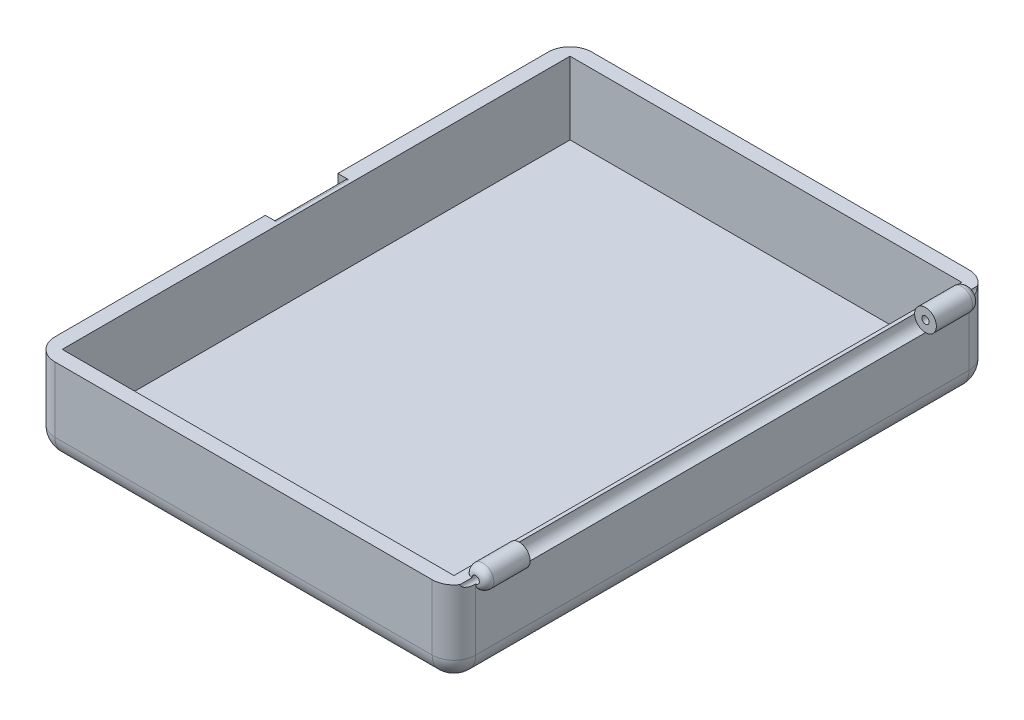
ISO-10303-21;
HEADER;
FILE_DESCRIPTION(('STEP AP214'),'2;1');
FILE_NAME('part.step','',(''),(''),'','','');
FILE_SCHEMA(('AUTOMOTIVE_DESIGN { 1 0 10303 214 1 1 1 1 }'));
ENDSEC;
DATA;
#1=APPLICATION_CONTEXT('core data for automotive mechanical design processes');
#2=APPLICATION_PROTOCOL_DEFINITION('international standard','automotive_design',2000,#1);
#3=PRODUCT_CONTEXT('',#1,'mechanical');
#4=PRODUCT('Part','Part','',(#3));
#5=PRODUCT_RELATED_PRODUCT_CATEGORY('part','',(#4));
#6=PRODUCT_DEFINITION_FORMATION('','',#4);
#7=PRODUCT_DEFINITION_CONTEXT('part definition',#1,'design');
#8=PRODUCT_DEFINITION('design','',#6,#7);
#9=PRODUCT_DEFINITION_SHAPE('','',#8);
#10=(LENGTH_UNIT() NAMED_UNIT(*) SI_UNIT(.MILLI.,.METRE.));
#11=(NAMED_UNIT(*) PLANE_ANGLE_UNIT() SI_UNIT($,.RADIAN.));
#12=(NAMED_UNIT(*) SI_UNIT($,.STERADIAN.) SOLID_ANGLE_UNIT());
#13=UNCERTAINTY_MEASURE_WITH_UNIT(LENGTH_MEASURE(1.E-05),#10,'distance_accuracy_value','');
#14=(GEOMETRIC_REPRESENTATION_CONTEXT(3) GLOBAL_UNCERTAINTY_ASSIGNED_CONTEXT((#13)) GLOBAL_UNIT_ASSIGNED_CONTEXT((#10,
#11,#12)) REPRESENTATION_CONTEXT('',''));
#15=CARTESIAN_POINT('',(0.,0.,0.));
#16=DIRECTION('',(0.,0.,1.));
#17=DIRECTION('',(1.,0.,0.));
#18=AXIS2_PLACEMENT_3D('',#15,#16,#17);
#19=CARTESIAN_POINT('',(-2.,5.,-40.));
#20=DIRECTION('',(0.,0.,-1.));
#21=DIRECTION('',(-1.,0.,0.));
#22=AXIS2_PLACEMENT_3D('',#19,#20,#21);
#23=PLANE('',#22);
#24=CARTESIAN_POINT('',(-0.499999999999997,11.5,-40.));
#25=DIRECTION('',(0.,0.,1.));
#26=DIRECTION('',(1.,0.,0.));
#27=AXIS2_PLACEMENT_3D('',#24,#25,#26);
#28=CIRCLE('',#27,0.5);
#29=CARTESIAN_POINT('',(-0.499999999999997,12.,-40.));
#30=VERTEX_POINT('',#29);
#31=CARTESIAN_POINT('',(-0.499999999999997,11.,-40.));
#32=VERTEX_POINT('',#31);
#33=EDGE_CURVE('E223',#30,#32,#28,.T.);
#34=ORIENTED_EDGE('',*,*,#33,.F.);
#35=DIRECTION('',(-1.,0.,0.));
#36=VECTOR('',#35,1.);
#37=CARTESIAN_POINT('',(-2.,12.,-40.));
#38=LINE('',#37,#36);
#39=CARTESIAN_POINT('',(-2.,12.,-40.));
#40=VERTEX_POINT('',#39);
#41=EDGE_CURVE('E212',#30,#40,#38,.T.);
#42=ORIENTED_EDGE('',*,*,#41,.T.);
#43=DIRECTION('',(0.,1.,0.));
#44=VECTOR('',#43,1.);
#45=CARTESIAN_POINT('',(-2.,5.,-40.));
#46=LINE('',#45,#44);
#47=CARTESIAN_POINT('',(-2.,5.,-40.));
#48=VERTEX_POINT('',#47);
#49=EDGE_CURVE('E246',#48,#40,#46,.T.);
#50=ORIENTED_EDGE('',*,*,#49,.F.);
#51=DIRECTION('',(-1.,0.,0.));
#52=VECTOR('',#51,1.);
#53=CARTESIAN_POINT('',(-2.,5.,-40.));
#54=LINE('',#53,#52);
#55=CARTESIAN_POINT('',(-0.499999999999997,5.,-40.));
#56=VERTEX_POINT('',#55);
#57=EDGE_CURVE('E241',#56,#48,#54,.T.);
#58=ORIENTED_EDGE('',*,*,#57,.F.);
#59=DIRECTION('',(0.,1.,0.));
#60=VECTOR('',#59,1.);
#61=CARTESIAN_POINT('',(-0.499999999999997,5.,-40.));
#62=LINE('',#61,#60);
#63=EDGE_CURVE('E251',#56,#32,#62,.T.);
#64=ORIENTED_EDGE('',*,*,#63,.T.);
#65=EDGE_LOOP('',(#34,#42,#50,#58,#64));
#66=FACE_BOUND('',#65,.T.);
#67=ADVANCED_FACE('F39',(#66),#23,.F.);
#68=CARTESIAN_POINT('',(-0.499999999999997,5.,-40.));
#69=DIRECTION('',(1.,0.,0.));
#70=DIRECTION('',(0.,0.,-1.));
#71=AXIS2_PLACEMENT_3D('',#68,#69,#70);
#72=PLANE('',#71);
#73=DIRECTION('',(0.,0.,-1.));
#74=VECTOR('',#73,1.);
#75=CARTESIAN_POINT('',(-0.499999999999995,11.,-30.));
#76=LINE('',#75,#74);
#77=CARTESIAN_POINT('',(-0.499999999999995,11.,-30.));
#78=VERTEX_POINT('',#77);
#79=EDGE_CURVE('E55',#32,#78,#76,.F.);
#80=ORIENTED_EDGE('',*,*,#79,.F.);
#81=ORIENTED_EDGE('',*,*,#63,.F.);
#82=DIRECTION('',(0.,0.,-1.));
#83=VECTOR('',#82,1.);
#84=CARTESIAN_POINT('',(-0.499999999999997,5.,-40.));
#85=LINE('',#84,#83);
#86=CARTESIAN_POINT('',(-0.499999999999995,5.,-30.));
#87=VERTEX_POINT('',#86);
#88=EDGE_CURVE('E237',#87,#56,#85,.T.);
#89=ORIENTED_EDGE('',*,*,#88,.F.);
#90=DIRECTION('',(0.,1.,0.));
#91=VECTOR('',#90,1.);
#92=CARTESIAN_POINT('',(-0.499999999999995,5.,-30.));
#93=LINE('',#92,#91);
#94=EDGE_CURVE('E254',#87,#78,#93,.T.);
#95=ORIENTED_EDGE('',*,*,#94,.T.);
#96=EDGE_LOOP('',(#80,#81,#89,#95));
#97=FACE_BOUND('',#96,.T.);
#98=ADVANCED_FACE('F324',(#97),#72,.F.);
#99=CARTESIAN_POINT('',(-2.,5.,-30.));
#100=DIRECTION('',(0.,0.,1.));
#101=DIRECTION('',(1.,0.,0.));
#102=AXIS2_PLACEMENT_3D('',#99,#100,#101);
#103=PLANE('',#102);
#104=CARTESIAN_POINT('',(-0.499999999999997,11.5,-30.));
#105=DIRECTION('',(0.,0.,1.));
#106=DIRECTION('',(1.,0.,0.));
#107=AXIS2_PLACEMENT_3D('',#104,#105,#106);
#108=CIRCLE('',#107,0.5);
#109=CARTESIAN_POINT('',(-0.499999999999995,12.,-30.));
#110=VERTEX_POINT('',#109);
#111=EDGE_CURVE('E11',#78,#110,#108,.F.);
#112=ORIENTED_EDGE('',*,*,#111,.F.);
#113=ORIENTED_EDGE('',*,*,#94,.F.);
#114=DIRECTION('',(1.,0.,0.));
#115=VECTOR('',#114,1.);
#116=CARTESIAN_POINT('',(-2.,5.,-30.));
#117=LINE('',#116,#115);
#118=CARTESIAN_POINT('',(-2.,5.,-30.));
#119=VERTEX_POINT('',#118);
#120=EDGE_CURVE('E233',#119,#87,#117,.T.);
#121=ORIENTED_EDGE('',*,*,#120,.F.);
#122=DIRECTION('',(0.,1.,0.));
#123=VECTOR('',#122,1.);
#124=CARTESIAN_POINT('',(-2.,5.,-30.));
#125=LINE('',#124,#123);
#126=CARTESIAN_POINT('',(-2.,12.,-30.));
#127=VERTEX_POINT('',#126);
#128=EDGE_CURVE('E219',#119,#127,#125,.T.);
#129=ORIENTED_EDGE('',*,*,#128,.T.);
#130=DIRECTION('',(1.,0.,0.));
#131=VECTOR('',#130,1.);
#132=CARTESIAN_POINT('',(-2.,12.,-30.));
#133=LINE('',#132,#131);
#134=EDGE_CURVE('E210',#127,#110,#133,.T.);
#135=ORIENTED_EDGE('',*,*,#134,.T.);
#136=EDGE_LOOP('',(#112,#113,#121,#129,#135));
#137=FACE_BOUND('',#136,.T.);
#138=ADVANCED_FACE('F217',(#137),#103,.F.);
#139=CARTESIAN_POINT('',(56.,12.,-0.999999999999959));
#140=DIRECTION('',(0.,0.,-1.));
#141=DIRECTION('',(-1.,0.,0.));
#142=AXIS2_PLACEMENT_3D('',#139,#140,#141);
#143=CYLINDRICAL_SURFACE('',#142,1.5);
#144=DIRECTION('',(0.,0.,-1.));
#145=VECTOR('',#144,1.);
#146=CARTESIAN_POINT('',(56.,10.5,-0.999999999999959));
#147=LINE('',#146,#145);
#148=CARTESIAN_POINT('',(56.,10.5,-6.99999999999996));
#149=VERTEX_POINT('',#148);
#150=CARTESIAN_POINT('',(56.,10.5,-1.99999999999996));
#151=VERTEX_POINT('',#150);
#152=EDGE_CURVE('E558',#149,#151,#147,.F.);
#153=ORIENTED_EDGE('',*,*,#152,.F.);
#154=CARTESIAN_POINT('',(56.,12.,-6.99999999999996));
#155=DIRECTION('',(0.,0.,-1.));
#156=DIRECTION('',(-1.,0.,0.));
#157=AXIS2_PLACEMENT_3D('',#154,#155,#156);
#158=CIRCLE('',#157,1.5);
#159=CARTESIAN_POINT('',(54.5,12.,-6.99999999999996));
#160=VERTEX_POINT('',#159);
#161=EDGE_CURVE('E259',#160,#149,#158,.T.);
#162=ORIENTED_EDGE('',*,*,#161,.F.);
#163=DIRECTION('',(0.,0.,-1.));
#164=VECTOR('',#163,1.);
#165=CARTESIAN_POINT('',(54.5,12.,-0.999999999999959));
#166=LINE('',#165,#164);
#167=CARTESIAN_POINT('',(54.5,12.,-1.99999999999996));
#168=VERTEX_POINT('',#167);
#169=EDGE_CURVE('E430',#168,#160,#166,.T.);
#170=ORIENTED_EDGE('',*,*,#169,.F.);
#171=CARTESIAN_POINT('',(56.,12.,-1.99999999999996));
#172=DIRECTION('',(0.,0.,-1.));
#173=DIRECTION('',(-1.,0.,0.));
#174=AXIS2_PLACEMENT_3D('',#171,#172,#173);
#175=CIRCLE('',#174,1.5);
#176=EDGE_CURVE('E374',#168,#151,#175,.T.);
#177=ORIENTED_EDGE('',*,*,#176,.T.);
#178=EDGE_LOOP('',(#153,#162,#170,#177));
#179=FACE_BOUND('',#178,.T.);
#180=ADVANCED_FACE('F337',(#179),#143,.T.);
#181=CARTESIAN_POINT('',(56.,12.,-72.));
#182=DIRECTION('',(0.,0.,1.));
#183=DIRECTION('',(1.,0.,0.));
#184=AXIS2_PLACEMENT_3D('',#181,#182,#183);
#185=CYLINDRICAL_SURFACE('',#184,0.499999999999999);
#186=CARTESIAN_POINT('',(55.5,12.,0.658312395177697));
#187=CARTESIAN_POINT('',(55.4999615359514,11.9808117965599,0.658359000901538));
#188=CARTESIAN_POINT('',(55.5011022028067,11.9616973550036,0.656651360080132));
#189=CARTESIAN_POINT('',(55.5053981586321,11.9244660067287,0.650152822799728));
#190=CARTESIAN_POINT('',(55.5085287089811,11.9063397775614,0.645399781620211));
#191=CARTESIAN_POINT('',(55.5164585738691,11.8715112352337,0.633243663591332));
#192=CARTESIAN_POINT('',(55.5212507254402,11.8548031872199,0.625851957739243));
#193=CARTESIAN_POINT('',(55.5321006879087,11.8229291394286,0.608902979096022));
#194=CARTESIAN_POINT('',(55.5381625027487,11.8077682491741,0.599338847200031));
#195=CARTESIAN_POINT('',(55.5543495838743,11.7720819233287,0.573412942822814));
#196=CARTESIAN_POINT('',(55.5650123613976,11.7525585594581,0.556014121615097));
#197=CARTESIAN_POINT('',(55.5873307308571,11.7168966525697,0.518617675701948));
#198=CARTESIAN_POINT('',(55.5989882255931,11.7007648109609,0.49861502991361));
#199=CARTESIAN_POINT('',(55.6308270280106,11.661277924017,0.44235327645327));
#200=CARTESIAN_POINT('',(55.651337737695,11.6406230066929,0.404403313902147));
#201=CARTESIAN_POINT('',(55.6916785877069,11.6054721967032,0.325464202490945));
#202=CARTESIAN_POINT('',(55.7115068636278,11.5909921086199,0.284467566484643));
#203=CARTESIAN_POINT('',(55.7496063336876,11.5666296831386,0.200737193937386));
#204=CARTESIAN_POINT('',(55.7678847946304,11.5567247940153,0.158013131653644));
#205=CARTESIAN_POINT('',(55.8026300683609,11.540201279739,0.0711939405220482));
#206=CARTESIAN_POINT('',(55.8190950642845,11.5335859273874,0.0270974924207964));
#207=CARTESIAN_POINT('',(55.8500610542317,11.5227285708738,-0.0622389891236715));
#208=CARTESIAN_POINT('',(55.864554568879,11.5184954237564,-0.107482645120754));
#209=CARTESIAN_POINT('',(55.891405695681,11.5117393431649,-0.19872827903056));
#210=CARTESIAN_POINT('',(55.9037627844491,11.5092168283242,-0.244730439748595));
#211=CARTESIAN_POINT('',(55.9291909661628,11.5048294742857,-0.349281699529611));
#212=CARTESIAN_POINT('',(55.9416212747959,11.5033030750241,-0.408000954890271));
#213=CARTESIAN_POINT('',(55.9629425437991,11.5012613747875,-0.526106877400987));
#214=CARTESIAN_POINT('',(55.9718324881697,11.5007463638901,-0.585493731115526));
#215=CARTESIAN_POINT('',(55.9859484398418,11.5001452898865,-0.703980436273835));
#216=CARTESIAN_POINT('',(55.991217107298,11.5000541568205,-0.763075188920547));
#217=CARTESIAN_POINT('',(55.9982432499278,11.5000013807879,-0.881446785583726));
#218=CARTESIAN_POINT('',(56.0000022866533,11.500039680212,-0.940723536859618));
#219=CARTESIAN_POINT('',(56.,11.5,-1.));
#220=B_SPLINE_CURVE_WITH_KNOTS('',3,(#186,#187,#188,#189,#190,#191,#192,#193,#194,#195,#196,
#197,#198,#199,#200,#201,#202,#203,#204,#205,#206,#207,#208,#209,#210,#211,#212,#213,#214,#215,
#216,#217,#218,#219),.UNSPECIFIED.,.F.,.F.,(4,2,2,2,2,2,2,2,2,2,2,2,2,2,2,2,4),(0.,
0.0573381720094235,0.113977086295263,0.17037481166274,0.226953142388571,0.311198558755972,
0.395608905298973,0.538283538979197,0.681321190365303,0.823646063340482,0.966112255212225,
1.10910469519338,1.25213211630405,1.43212269574156,1.61216489099272,1.79004798543928,
1.96785191608969),.UNSPECIFIED.);
#221=CARTESIAN_POINT('',(55.5,12.,0.658312395177697));
#222=VERTEX_POINT('',#221);
#223=CARTESIAN_POINT('',(56.,11.5,-0.999999999999959));
#224=VERTEX_POINT('',#223);
#225=EDGE_CURVE('E269',#222,#224,#220,.T.);
#226=ORIENTED_EDGE('',*,*,#225,.T.);
#227=CARTESIAN_POINT('',(56.,12.,-0.999999999999959));
#228=DIRECTION('',(0.,0.,-1.));
#229=DIRECTION('',(-1.,0.,0.));
#230=AXIS2_PLACEMENT_3D('',#227,#228,#229);
#231=CIRCLE('',#230,0.499999999999999);
#232=CARTESIAN_POINT('',(55.5,12.,-0.999999999999959));
#233=VERTEX_POINT('',#232);
#234=EDGE_CURVE('E378',#233,#224,#231,.T.);
#235=ORIENTED_EDGE('',*,*,#234,.F.);
#236=DIRECTION('',(0.,0.,1.));
#237=VECTOR('',#236,1.);
#238=CARTESIAN_POINT('',(55.5,12.,-72.));
#239=LINE('',#238,#237);
#240=EDGE_CURVE('E278',#222,#233,#239,.F.);
#241=ORIENTED_EDGE('',*,*,#240,.F.);
#242=EDGE_LOOP('',(#226,#235,#241));
#243=FACE_BOUND('',#242,.T.);
#244=CARTESIAN_POINT('',(56.,12.,-6.99999999999996));
#245=DIRECTION('',(0.,0.,-1.));
#246=DIRECTION('',(-1.,0.,0.));
#247=AXIS2_PLACEMENT_3D('',#244,#245,#246);
#248=CIRCLE('',#247,0.499999999999999);
#249=CARTESIAN_POINT('',(55.5,12.,-6.99999999999996));
#250=VERTEX_POINT('',#249);
#251=EDGE_CURVE('E279',#250,#250,#248,.F.);
#252=ORIENTED_EDGE('',*,*,#251,.F.);
#253=EDGE_LOOP('',(#252));
#254=FACE_BOUND('',#253,.T.);
#255=ADVANCED_FACE('F293',(#243,#254),#185,.F.);
#256=CARTESIAN_POINT('',(0.,12.,0.));
#257=DIRECTION('',(0.,-1.,0.));
#258=DIRECTION('',(0.,0.,-1.));
#259=AXIS2_PLACEMENT_3D('',#256,#257,#258);
#260=PLANE('',#259);
#261=DIRECTION('',(0.,0.,1.));
#262=VECTOR('',#261,1.);
#263=CARTESIAN_POINT('',(0.,12.,0.));
#264=LINE('',#263,#262);
#265=CARTESIAN_POINT('',(0.,12.,-70.));
#266=VERTEX_POINT('',#265);
#267=CARTESIAN_POINT('',(0.,12.,0.));
#268=VERTEX_POINT('',#267);
#269=EDGE_CURVE('E531',#266,#268,#264,.T.);
#270=ORIENTED_EDGE('',*,*,#269,.F.);
#271=DIRECTION('',(-1.,0.,0.));
#272=VECTOR('',#271,1.);
#273=CARTESIAN_POINT('',(0.,12.,-70.));
#274=LINE('',#273,#272);
#275=CARTESIAN_POINT('',(54.,12.,-70.));
#276=VERTEX_POINT('',#275);
#277=EDGE_CURVE('E521',#276,#266,#274,.T.);
#278=ORIENTED_EDGE('',*,*,#277,.F.);
#279=DIRECTION('',(0.,0.,-1.));
#280=VECTOR('',#279,1.);
#281=CARTESIAN_POINT('',(54.,12.,0.));
#282=LINE('',#281,#280);
#283=CARTESIAN_POINT('',(54.,12.,0.));
#284=VERTEX_POINT('',#283);
#285=EDGE_CURVE('E524',#284,#276,#282,.T.);
#286=ORIENTED_EDGE('',*,*,#285,.F.);
#287=DIRECTION('',(1.,0.,0.));
#288=VECTOR('',#287,1.);
#289=CARTESIAN_POINT('',(0.,12.,0.));
#290=LINE('',#289,#288);
#291=EDGE_CURVE('E528',#268,#284,#290,.T.);
#292=ORIENTED_EDGE('',*,*,#291,.F.);
#293=EDGE_LOOP('',(#270,#278,#286,#292));
#294=FACE_BOUND('',#293,.T.);
#295=DIRECTION('',(0.,0.,1.));
#296=VECTOR('',#295,1.);
#297=CARTESIAN_POINT('',(-2.,12.,2.));
#298=LINE('',#297,#296);
#299=CARTESIAN_POINT('',(-2.,12.,-69.));
#300=VERTEX_POINT('',#299);
#301=EDGE_CURVE('E502',#300,#40,#298,.T.);
#302=ORIENTED_EDGE('',*,*,#301,.T.);
#303=ORIENTED_EDGE('',*,*,#41,.F.);
#304=DIRECTION('',(0.,0.,-1.));
#305=VECTOR('',#304,1.);
#306=CARTESIAN_POINT('',(-0.499999999999997,12.,-40.));
#307=LINE('',#306,#305);
#308=EDGE_CURVE('E207',#110,#30,#307,.T.);
#309=ORIENTED_EDGE('',*,*,#308,.F.);
#310=ORIENTED_EDGE('',*,*,#134,.F.);
#311=CARTESIAN_POINT('',(-2.,12.,-1.));
#312=VERTEX_POINT('',#311);
#313=EDGE_CURVE('E505',#127,#312,#298,.T.);
#314=ORIENTED_EDGE('',*,*,#313,.T.);
#315=CARTESIAN_POINT('',(1.,12.,-1.));
#316=DIRECTION('',(0.,-1.,0.));
#317=DIRECTION('',(0.,0.,-1.));
#318=AXIS2_PLACEMENT_3D('',#315,#316,#317);
#319=CIRCLE('',#318,3.);
#320=CARTESIAN_POINT('',(0.999999999999999,12.,2.));
#321=VERTEX_POINT('',#320);
#322=EDGE_CURVE('E461',#312,#321,#319,.F.);
#323=ORIENTED_EDGE('',*,*,#322,.T.);
#324=DIRECTION('',(1.,0.,0.));
#325=VECTOR('',#324,1.);
#326=CARTESIAN_POINT('',(-2.,12.,2.));
#327=LINE('',#326,#325);
#328=CARTESIAN_POINT('',(53.,12.,2.));
#329=VERTEX_POINT('',#328);
#330=EDGE_CURVE('E498',#321,#329,#327,.T.);
#331=ORIENTED_EDGE('',*,*,#330,.T.);
#332=CARTESIAN_POINT('',(53.,12.,-1.));
#333=DIRECTION('',(0.,-1.,0.));
#334=DIRECTION('',(0.,0.,-1.));
#335=AXIS2_PLACEMENT_3D('',#332,#333,#334);
#336=CIRCLE('',#335,3.);
#337=EDGE_CURVE('E470',#329,#222,#336,.F.);
#338=ORIENTED_EDGE('',*,*,#337,.T.);
#339=ORIENTED_EDGE('',*,*,#240,.T.);
#340=CARTESIAN_POINT('',(55.5,12.,-1.99999999999996));
#341=DIRECTION('',(0.,-1.,0.));
#342=DIRECTION('',(0.,0.,-1.));
#343=AXIS2_PLACEMENT_3D('',#340,#341,#342);
#344=CIRCLE('',#343,1.);
#345=EDGE_CURVE('E48',#233,#168,#344,.T.);
#346=ORIENTED_EDGE('',*,*,#345,.T.);
#347=ORIENTED_EDGE('',*,*,#169,.T.);
#348=CARTESIAN_POINT('',(54.5,12.,-63.));
#349=VERTEX_POINT('',#348);
#350=EDGE_CURVE('E549',#160,#349,#166,.T.);
#351=ORIENTED_EDGE('',*,*,#350,.T.);
#352=CARTESIAN_POINT('',(54.5,12.,-68.));
#353=VERTEX_POINT('',#352);
#354=EDGE_CURVE('E550',#349,#353,#166,.T.);
#355=ORIENTED_EDGE('',*,*,#354,.T.);
#356=CARTESIAN_POINT('',(55.5,12.,-68.));
#357=DIRECTION('',(0.,-1.,0.));
#358=DIRECTION('',(0.,0.,-1.));
#359=AXIS2_PLACEMENT_3D('',#356,#357,#358);
#360=CIRCLE('',#359,1.);
#361=CARTESIAN_POINT('',(55.5,12.,-69.));
#362=VERTEX_POINT('',#361);
#363=EDGE_CURVE('E364',#353,#362,#360,.T.);
#364=ORIENTED_EDGE('',*,*,#363,.T.);
#365=CARTESIAN_POINT('',(55.5,12.,-70.6583123951777));
#366=VERTEX_POINT('',#365);
#367=EDGE_CURVE('E306',#362,#366,#239,.F.);
#368=ORIENTED_EDGE('',*,*,#367,.T.);
#369=CARTESIAN_POINT('',(53.,12.,-69.));
#370=DIRECTION('',(0.,-1.,0.));
#371=DIRECTION('',(0.,0.,-1.));
#372=AXIS2_PLACEMENT_3D('',#369,#370,#371);
#373=CIRCLE('',#372,3.);
#374=CARTESIAN_POINT('',(53.,12.,-72.));
#375=VERTEX_POINT('',#374);
#376=EDGE_CURVE('E467',#366,#375,#373,.F.);
#377=ORIENTED_EDGE('',*,*,#376,.T.);
#378=DIRECTION('',(-1.,0.,0.));
#379=VECTOR('',#378,1.);
#380=CARTESIAN_POINT('',(-2.,12.,-72.));
#381=LINE('',#380,#379);
#382=CARTESIAN_POINT('',(0.999999999999999,12.,-72.));
#383=VERTEX_POINT('',#382);
#384=EDGE_CURVE('E494',#375,#383,#381,.T.);
#385=ORIENTED_EDGE('',*,*,#384,.T.);
#386=CARTESIAN_POINT('',(1.,12.,-69.));
#387=DIRECTION('',(0.,-1.,0.));
#388=DIRECTION('',(0.,0.,-1.));
#389=AXIS2_PLACEMENT_3D('',#386,#387,#388);
#390=CIRCLE('',#389,3.);
#391=EDGE_CURVE('E464',#383,#300,#390,.F.);
#392=ORIENTED_EDGE('',*,*,#391,.T.);
#393=EDGE_LOOP('',(#302,#303,#309,#310,#314,#323,#331,#338,#339,#346,#347,#351,#355,#364,#368,
#377,#385,#392));
#394=FACE_BOUND('',#393,.T.);
#395=ADVANCED_FACE('F209',(#294,#394),#260,.F.);
#396=CARTESIAN_POINT('',(0.,0.,0.));
#397=DIRECTION('',(0.,-1.,0.));
#398=DIRECTION('',(0.,0.,-1.));
#399=AXIS2_PLACEMENT_3D('',#396,#397,#398);
#400=PLANE('',#399);
#401=DIRECTION('',(1.,0.,0.));
#402=VECTOR('',#401,1.);
#403=CARTESIAN_POINT('',(-2.,0.,-1.));
#404=LINE('',#403,#402);
#405=CARTESIAN_POINT('',(53.,0.,-1.));
#406=VERTEX_POINT('',#405);
#407=CARTESIAN_POINT('',(1.,0.,-1.));
#408=VERTEX_POINT('',#407);
#409=EDGE_CURVE('E455',#406,#408,#404,.F.);
#410=ORIENTED_EDGE('',*,*,#409,.T.);
#411=DIRECTION('',(0.,0.,1.));
#412=VECTOR('',#411,1.);
#413=CARTESIAN_POINT('',(1.,0.,-72.));
#414=LINE('',#413,#412);
#415=CARTESIAN_POINT('',(1.,0.,-69.));
#416=VERTEX_POINT('',#415);
#417=EDGE_CURVE('E448',#408,#416,#414,.F.);
#418=ORIENTED_EDGE('',*,*,#417,.T.);
#419=DIRECTION('',(-1.,0.,0.));
#420=VECTOR('',#419,1.);
#421=CARTESIAN_POINT('',(56.,0.,-69.));
#422=LINE('',#421,#420);
#423=CARTESIAN_POINT('',(53.,0.,-69.));
#424=VERTEX_POINT('',#423);
#425=EDGE_CURVE('E452',#416,#424,#422,.F.);
#426=ORIENTED_EDGE('',*,*,#425,.T.);
#427=DIRECTION('',(0.,0.,-1.));
#428=VECTOR('',#427,1.);
#429=CARTESIAN_POINT('',(53.,0.,2.));
#430=LINE('',#429,#428);
#431=EDGE_CURVE('E458',#424,#406,#430,.F.);
#432=ORIENTED_EDGE('',*,*,#431,.T.);
#433=EDGE_LOOP('',(#410,#418,#426,#432));
#434=FACE_BOUND('',#433,.T.);
#435=ADVANCED_FACE('F668',(#434),#400,.T.);
#436=CARTESIAN_POINT('',(-2.,12.,2.));
#437=DIRECTION('',(1.,0.,0.));
#438=DIRECTION('',(0.,0.,-1.));
#439=AXIS2_PLACEMENT_3D('',#436,#437,#438);
#440=PLANE('',#439);
#441=DIRECTION('',(0.,0.,1.));
#442=VECTOR('',#441,1.);
#443=CARTESIAN_POINT('',(-2.,5.,-40.));
#444=LINE('',#443,#442);
#445=EDGE_CURVE('E229',#48,#119,#444,.T.);
#446=ORIENTED_EDGE('',*,*,#445,.F.);
#447=ORIENTED_EDGE('',*,*,#49,.T.);
#448=ORIENTED_EDGE('',*,*,#301,.F.);
#449=DIRECTION('',(0.,-1.,0.));
#450=VECTOR('',#449,1.);
#451=CARTESIAN_POINT('',(-2.,12.,-69.));
#452=LINE('',#451,#450);
#453=CARTESIAN_POINT('',(-2.,3.,-69.));
#454=VERTEX_POINT('',#453);
#455=EDGE_CURVE('E481',#300,#454,#452,.T.);
#456=ORIENTED_EDGE('',*,*,#455,.T.);
#457=DIRECTION('',(0.,0.,1.));
#458=VECTOR('',#457,1.);
#459=CARTESIAN_POINT('',(-2.,3.,2.));
#460=LINE('',#459,#458);
#461=CARTESIAN_POINT('',(-2.,3.,-1.));
#462=VERTEX_POINT('',#461);
#463=EDGE_CURVE('E478',#454,#462,#460,.T.);
#464=ORIENTED_EDGE('',*,*,#463,.T.);
#465=DIRECTION('',(0.,-1.,0.));
#466=VECTOR('',#465,1.);
#467=CARTESIAN_POINT('',(-2.,12.,-1.));
#468=LINE('',#467,#466);
#469=EDGE_CURVE('E474',#462,#312,#468,.F.);
#470=ORIENTED_EDGE('',*,*,#469,.T.);
#471=ORIENTED_EDGE('',*,*,#313,.F.);
#472=ORIENTED_EDGE('',*,*,#128,.F.);
#473=EDGE_LOOP('',(#446,#447,#448,#456,#464,#470,#471,#472));
#474=FACE_BOUND('',#473,.T.);
#475=ADVANCED_FACE('F607',(#474),#440,.F.);
#476=CARTESIAN_POINT('',(-2.,12.,2.));
#477=DIRECTION('',(0.,0.,-1.));
#478=DIRECTION('',(-1.,0.,0.));
#479=AXIS2_PLACEMENT_3D('',#476,#477,#478);
#480=PLANE('',#479);
#481=ORIENTED_EDGE('',*,*,#330,.F.);
#482=DIRECTION('',(0.,-1.,0.));
#483=VECTOR('',#482,1.);
#484=CARTESIAN_POINT('',(1.,12.,2.));
#485=LINE('',#484,#483);
#486=CARTESIAN_POINT('',(1.,3.,2.));
#487=VERTEX_POINT('',#486);
#488=EDGE_CURVE('E484',#321,#487,#485,.T.);
#489=ORIENTED_EDGE('',*,*,#488,.T.);
#490=DIRECTION('',(1.,0.,0.));
#491=VECTOR('',#490,1.);
#492=CARTESIAN_POINT('',(56.,3.,2.));
#493=LINE('',#492,#491);
#494=CARTESIAN_POINT('',(53.,3.,2.));
#495=VERTEX_POINT('',#494);
#496=EDGE_CURVE('E488',#487,#495,#493,.T.);
#497=ORIENTED_EDGE('',*,*,#496,.T.);
#498=DIRECTION('',(0.,-1.,0.));
#499=VECTOR('',#498,1.);
#500=CARTESIAN_POINT('',(53.,12.,2.));
#501=LINE('',#500,#499);
#502=EDGE_CURVE('E491',#495,#329,#501,.F.);
#503=ORIENTED_EDGE('',*,*,#502,.T.);
#504=EDGE_LOOP('',(#481,#489,#497,#503));
#505=FACE_BOUND('',#504,.T.);
#506=ADVANCED_FACE('F619',(#505),#480,.F.);
#507=CARTESIAN_POINT('',(56.,12.,2.));
#508=DIRECTION('',(-1.,0.,0.));
#509=DIRECTION('',(0.,0.,1.));
#510=AXIS2_PLACEMENT_3D('',#507,#508,#509);
#511=PLANE('',#510);
#512=DIRECTION('',(0.,-1.,0.));
#513=VECTOR('',#512,1.);
#514=CARTESIAN_POINT('',(56.,12.,-69.));
#515=LINE('',#514,#513);
#516=CARTESIAN_POINT('',(56.,3.,-69.));
#517=VERTEX_POINT('',#516);
#518=CARTESIAN_POINT('',(56.,11.5,-69.));
#519=VERTEX_POINT('',#518);
#520=EDGE_CURVE('E382',#517,#519,#515,.F.);
#521=ORIENTED_EDGE('',*,*,#520,.T.);
#522=CARTESIAN_POINT('',(56.,11.5,-68.));
#523=DIRECTION('',(-1.,0.,0.));
#524=DIRECTION('',(0.,0.,1.));
#525=AXIS2_PLACEMENT_3D('',#522,#523,#524);
#526=CIRCLE('',#525,1.);
#527=CARTESIAN_POINT('',(56.,10.5,-68.));
#528=VERTEX_POINT('',#527);
#529=EDGE_CURVE('E367',#519,#528,#526,.T.);
#530=ORIENTED_EDGE('',*,*,#529,.T.);
#531=CARTESIAN_POINT('',(56.,10.5,-63.));
#532=VERTEX_POINT('',#531);
#533=EDGE_CURVE('E308',#528,#532,#147,.F.);
#534=ORIENTED_EDGE('',*,*,#533,.T.);
#535=EDGE_CURVE('E557',#532,#149,#147,.F.);
#536=ORIENTED_EDGE('',*,*,#535,.T.);
#537=ORIENTED_EDGE('',*,*,#152,.T.);
#538=CARTESIAN_POINT('',(56.,11.5,-1.99999999999996));
#539=DIRECTION('',(-1.,0.,0.));
#540=DIRECTION('',(0.,0.,1.));
#541=AXIS2_PLACEMENT_3D('',#538,#539,#540);
#542=CIRCLE('',#541,1.);
#543=EDGE_CURVE('E360',#151,#224,#542,.T.);
#544=ORIENTED_EDGE('',*,*,#543,.T.);
#545=DIRECTION('',(0.,-1.,0.));
#546=VECTOR('',#545,1.);
#547=CARTESIAN_POINT('',(56.,12.,-1.));
#548=LINE('',#547,#546);
#549=CARTESIAN_POINT('',(56.,3.,-1.));
#550=VERTEX_POINT('',#549);
#551=EDGE_CURVE('E436',#224,#550,#548,.T.);
#552=ORIENTED_EDGE('',*,*,#551,.T.);
#553=DIRECTION('',(0.,0.,-1.));
#554=VECTOR('',#553,1.);
#555=CARTESIAN_POINT('',(56.,3.,-72.));
#556=LINE('',#555,#554);
#557=EDGE_CURVE('E433',#550,#517,#556,.T.);
#558=ORIENTED_EDGE('',*,*,#557,.T.);
#559=EDGE_LOOP('',(#521,#530,#534,#536,#537,#544,#552,#558));
#560=FACE_BOUND('',#559,.T.);
#561=ADVANCED_FACE('F642',(#560),#511,.F.);
#562=CARTESIAN_POINT('',(-2.,12.,-72.));
#563=DIRECTION('',(0.,0.,1.));
#564=DIRECTION('',(1.,0.,0.));
#565=AXIS2_PLACEMENT_3D('',#562,#563,#564);
#566=PLANE('',#565);
#567=DIRECTION('',(-1.,0.,0.));
#568=VECTOR('',#567,1.);
#569=CARTESIAN_POINT('',(-2.,3.,-72.));
#570=LINE('',#569,#568);
#571=CARTESIAN_POINT('',(53.,3.,-72.));
#572=VERTEX_POINT('',#571);
#573=CARTESIAN_POINT('',(1.,3.,-72.));
#574=VERTEX_POINT('',#573);
#575=EDGE_CURVE('E442',#572,#574,#570,.T.);
#576=ORIENTED_EDGE('',*,*,#575,.T.);
#577=DIRECTION('',(0.,-1.,0.));
#578=VECTOR('',#577,1.);
#579=CARTESIAN_POINT('',(1.,12.,-72.));
#580=LINE('',#579,#578);
#581=EDGE_CURVE('E439',#574,#383,#580,.F.);
#582=ORIENTED_EDGE('',*,*,#581,.T.);
#583=ORIENTED_EDGE('',*,*,#384,.F.);
#584=DIRECTION('',(0.,-1.,0.));
#585=VECTOR('',#584,1.);
#586=CARTESIAN_POINT('',(53.,12.,-72.));
#587=LINE('',#586,#585);
#588=EDGE_CURVE('E445',#375,#572,#587,.T.);
#589=ORIENTED_EDGE('',*,*,#588,.T.);
#590=EDGE_LOOP('',(#576,#582,#583,#589));
#591=FACE_BOUND('',#590,.T.);
#592=ADVANCED_FACE('F585',(#591),#566,.F.);
#593=CARTESIAN_POINT('',(0.,12.,0.));
#594=DIRECTION('',(1.,0.,0.));
#595=DIRECTION('',(0.,0.,-1.));
#596=AXIS2_PLACEMENT_3D('',#593,#594,#595);
#597=PLANE('',#596);
#598=DIRECTION('',(0.,0.,-1.));
#599=VECTOR('',#598,1.);
#600=CARTESIAN_POINT('',(0.,2.,0.));
#601=LINE('',#600,#599);
#602=CARTESIAN_POINT('',(0.,2.,0.));
#603=VERTEX_POINT('',#602);
#604=CARTESIAN_POINT('',(0.,2.,-70.));
#605=VERTEX_POINT('',#604);
#606=EDGE_CURVE('E534',#603,#605,#601,.T.);
#607=ORIENTED_EDGE('',*,*,#606,.T.);
#608=DIRECTION('',(0.,-1.,0.));
#609=VECTOR('',#608,1.);
#610=CARTESIAN_POINT('',(0.,12.,-70.));
#611=LINE('',#610,#609);
#612=EDGE_CURVE('E518',#266,#605,#611,.T.);
#613=ORIENTED_EDGE('',*,*,#612,.F.);
#614=ORIENTED_EDGE('',*,*,#269,.T.);
#615=DIRECTION('',(0.,-1.,0.));
#616=VECTOR('',#615,1.);
#617=CARTESIAN_POINT('',(0.,12.,0.));
#618=LINE('',#617,#616);
#619=EDGE_CURVE('E506',#268,#603,#618,.T.);
#620=ORIENTED_EDGE('',*,*,#619,.T.);
#621=EDGE_LOOP('',(#607,#613,#614,#620));
#622=FACE_BOUND('',#621,.T.);
#623=ADVANCED_FACE('F678',(#622),#597,.T.);
#624=CARTESIAN_POINT('',(0.,12.,0.));
#625=DIRECTION('',(0.,0.,-1.));
#626=DIRECTION('',(-1.,0.,0.));
#627=AXIS2_PLACEMENT_3D('',#624,#625,#626);
#628=PLANE('',#627);
#629=DIRECTION('',(1.,0.,0.));
#630=VECTOR('',#629,1.);
#631=CARTESIAN_POINT('',(0.,2.,0.));
#632=LINE('',#631,#630);
#633=CARTESIAN_POINT('',(54.,2.,0.));
#634=VERTEX_POINT('',#633);
#635=EDGE_CURVE('E387',#603,#634,#632,.T.);
#636=ORIENTED_EDGE('',*,*,#635,.F.);
#637=ORIENTED_EDGE('',*,*,#619,.F.);
#638=ORIENTED_EDGE('',*,*,#291,.T.);
#639=DIRECTION('',(0.,-1.,0.));
#640=VECTOR('',#639,1.);
#641=CARTESIAN_POINT('',(54.,12.,0.));
#642=LINE('',#641,#640);
#643=EDGE_CURVE('E510',#284,#634,#642,.T.);
#644=ORIENTED_EDGE('',*,*,#643,.T.);
#645=EDGE_LOOP('',(#636,#637,#638,#644));
#646=FACE_BOUND('',#645,.T.);
#647=ADVANCED_FACE('F741',(#646),#628,.T.);
#648=CARTESIAN_POINT('',(54.,12.,0.));
#649=DIRECTION('',(-1.,0.,0.));
#650=DIRECTION('',(0.,0.,1.));
#651=AXIS2_PLACEMENT_3D('',#648,#649,#650);
#652=PLANE('',#651);
#653=DIRECTION('',(0.,0.,-1.));
#654=VECTOR('',#653,1.);
#655=CARTESIAN_POINT('',(54.,2.,0.));
#656=LINE('',#655,#654);
#657=CARTESIAN_POINT('',(54.,2.,-70.));
#658=VERTEX_POINT('',#657);
#659=EDGE_CURVE('E541',#634,#658,#656,.T.);
#660=ORIENTED_EDGE('',*,*,#659,.F.);
#661=ORIENTED_EDGE('',*,*,#643,.F.);
#662=ORIENTED_EDGE('',*,*,#285,.T.);
#663=DIRECTION('',(0.,-1.,0.));
#664=VECTOR('',#663,1.);
#665=CARTESIAN_POINT('',(54.,12.,-70.));
#666=LINE('',#665,#664);
#667=EDGE_CURVE('E514',#276,#658,#666,.T.);
#668=ORIENTED_EDGE('',*,*,#667,.T.);
#669=EDGE_LOOP('',(#660,#661,#662,#668));
#670=FACE_BOUND('',#669,.T.);
#671=ADVANCED_FACE('F733',(#670),#652,.T.);
#672=CARTESIAN_POINT('',(0.,12.,-70.));
#673=DIRECTION('',(0.,0.,1.));
#674=DIRECTION('',(1.,0.,0.));
#675=AXIS2_PLACEMENT_3D('',#672,#673,#674);
#676=PLANE('',#675);
#677=DIRECTION('',(1.,0.,0.));
#678=VECTOR('',#677,1.);
#679=CARTESIAN_POINT('',(0.,2.,-70.));
#680=LINE('',#679,#678);
#681=EDGE_CURVE('E538',#605,#658,#680,.T.);
#682=ORIENTED_EDGE('',*,*,#681,.T.);
#683=ORIENTED_EDGE('',*,*,#667,.F.);
#684=ORIENTED_EDGE('',*,*,#277,.T.);
#685=ORIENTED_EDGE('',*,*,#612,.T.);
#686=EDGE_LOOP('',(#682,#683,#684,#685));
#687=FACE_BOUND('',#686,.T.);
#688=ADVANCED_FACE('F725',(#687),#676,.T.);
#689=CARTESIAN_POINT('',(0.,2.,0.));
#690=DIRECTION('',(0.,1.,0.));
#691=DIRECTION('',(0.,0.,1.));
#692=AXIS2_PLACEMENT_3D('',#689,#690,#691);
#693=PLANE('',#692);
#694=ORIENTED_EDGE('',*,*,#635,.T.);
#695=ORIENTED_EDGE('',*,*,#659,.T.);
#696=ORIENTED_EDGE('',*,*,#681,.F.);
#697=ORIENTED_EDGE('',*,*,#606,.F.);
#698=EDGE_LOOP('',(#694,#695,#696,#697));
#699=FACE_BOUND('',#698,.T.);
#700=ADVANCED_FACE('F314',(#699),#693,.T.);
#701=CARTESIAN_POINT('',(53.,12.,-69.));
#702=DIRECTION('',(0.,-1.,0.));
#703=DIRECTION('',(0.,0.,-1.));
#704=AXIS2_PLACEMENT_3D('',#701,#702,#703);
#705=CYLINDRICAL_SURFACE('',#704,3.);
#706=CARTESIAN_POINT('',(56.,11.5,-69.));
#707=CARTESIAN_POINT('',(56.0000005199056,11.5000098407388,-69.0420227982781));
#708=CARTESIAN_POINT('',(55.9991170511445,11.5000002513942,-69.084045270978));
#709=CARTESIAN_POINT('',(55.9955859427349,11.5000137776642,-69.1680182430285));
#710=CARTESIAN_POINT('',(55.9929382099897,11.5000368950047,-69.2099687384638));
#711=CARTESIAN_POINT('',(55.9858705738062,11.5001876657131,-69.2938621331985));
#712=CARTESIAN_POINT('',(55.9814447690287,11.5003156686771,-69.3358045372019));
#713=CARTESIAN_POINT('',(55.9708299845728,11.5008238301052,-69.4194604875588));
#714=CARTESIAN_POINT('',(55.9646410652255,11.5012039799418,-69.4611740416934));
#715=CARTESIAN_POINT('',(55.9435051632995,11.5029961533761,-69.5855132447728));
#716=CARTESIAN_POINT('',(55.9259581569273,11.5050575208107,-69.6677024479489));
#717=CARTESIAN_POINT('',(55.8840998265483,11.5131471783935,-69.8300379608899));
#718=CARTESIAN_POINT('',(55.8598027654416,11.5191671402792,-69.9101881934222));
#719=CARTESIAN_POINT('',(55.8251809365482,11.531497527422,-70.0093722242297));
#720=CARTESIAN_POINT('',(55.8177692684473,11.5343184586712,-70.0298790621602));
#721=CARTESIAN_POINT('',(55.8025327590561,11.5405710345507,-70.0706459007299));
#722=CARTESIAN_POINT('',(55.7947079269846,11.5440026655584,-70.0909059068644));
#723=CARTESIAN_POINT('',(55.7705865525409,11.5553800994296,-70.1514088226575));
#724=CARTESIAN_POINT('',(55.75369782653,11.5643904937986,-70.191218262531));
#725=CARTESIAN_POINT('',(55.7134976340735,11.5893477172083,-70.2806061192559));
#726=CARTESIAN_POINT('',(55.6897426486824,11.6065476935865,-70.329674569689));
#727=CARTESIAN_POINT('',(55.6535891085635,11.6390899770083,-70.3996999776278));
#728=CARTESIAN_POINT('',(55.6414832615044,11.6510213896918,-70.4223911221627));
#729=CARTESIAN_POINT('',(55.6174184948653,11.6775820141448,-70.4661989034643));
#730=CARTESIAN_POINT('',(55.6054593493204,11.6922063121518,-70.4873183112091));
#731=CARTESIAN_POINT('',(55.5850763372424,11.7206032479163,-70.522394510463));
#732=CARTESIAN_POINT('',(55.5765127219567,11.733683736954,-70.5368266757642));
#733=CARTESIAN_POINT('',(55.5600551008762,11.7618513218187,-70.5640878670894));
#734=CARTESIAN_POINT('',(55.5521617214469,11.7769402615514,-70.5769153986944));
#735=CARTESIAN_POINT('',(55.5374012384112,11.8094120260704,-70.6005598430862));
#736=CARTESIAN_POINT('',(55.5305471292102,11.8268194736971,-70.6113516541899));
#737=CARTESIAN_POINT('',(55.5185673950133,11.8636375929666,-70.6300126448793));
#738=CARTESIAN_POINT('',(55.5134350579393,11.8830400911335,-70.6378931860872));
#739=CARTESIAN_POINT('',(55.5064147574378,11.9186417865444,-70.6486109467333));
#740=CARTESIAN_POINT('',(55.5040473529792,11.9345190659309,-70.6521988627578));
#741=CARTESIAN_POINT('',(55.5008221679826,11.9669139259736,-70.6570731078552));
#742=CARTESIAN_POINT('',(55.4999781105873,11.9834359706464,-70.6583385162185));
#743=CARTESIAN_POINT('',(55.5,12.,-70.6583123951777));
#744=B_SPLINE_CURVE_WITH_KNOTS('',3,(#706,#707,#708,#709,#710,#711,#712,#713,#714,#715,#716,
#717,#718,#719,#720,#721,#722,#723,#724,#725,#726,#727,#728,#729,#730,#731,#732,#733,#734,#735,
#736,#737,#738,#739,#740,#741,#742,#743),.UNSPECIFIED.,.F.,.F.,(4,2,2,2,2,2,2,2,2,2,2,2,2,2,2,2,
2,2,4),(0.,0.12605847414002,0.252123600646824,0.378610634425717,0.505093340532964,
0.75696352790336,1.00830550795671,1.07425585321203,1.14020472753236,1.27260088735021,
1.44334213988643,1.52827184111027,1.61304807807225,1.6767481346378,1.74050708118652,
1.80500707964487,1.86925263028935,1.91836588799789,1.96791941735894),.UNSPECIFIED.);
#745=EDGE_CURVE('E299',#519,#366,#744,.T.);
#746=ORIENTED_EDGE('',*,*,#745,.F.);
#747=ORIENTED_EDGE('',*,*,#520,.F.);
#748=CARTESIAN_POINT('',(53.,3.,-69.));
#749=DIRECTION('',(0.,-1.,0.));
#750=DIRECTION('',(0.,0.,-1.));
#751=AXIS2_PLACEMENT_3D('',#748,#749,#750);
#752=CIRCLE('',#751,3.);
#753=EDGE_CURVE('E383',#572,#517,#752,.T.);
#754=ORIENTED_EDGE('',*,*,#753,.F.);
#755=ORIENTED_EDGE('',*,*,#588,.F.);
#756=ORIENTED_EDGE('',*,*,#376,.F.);
#757=EDGE_LOOP('',(#746,#747,#754,#755,#756));
#758=FACE_BOUND('',#757,.T.);
#759=ADVANCED_FACE('F310',(#758),#705,.T.);
#760=CARTESIAN_POINT('',(53.,3.,-69.));
#761=DIRECTION('',(0.,0.,1.));
#762=DIRECTION('',(1.,0.,0.));
#763=AXIS2_PLACEMENT_3D('',#760,#761,#762);
#764=SPHERICAL_SURFACE('',#763,3.);
#765=CARTESIAN_POINT('',(53.,3.,-69.));
#766=DIRECTION('',(1.,0.,0.));
#767=DIRECTION('',(0.,0.,-1.));
#768=AXIS2_PLACEMENT_3D('',#765,#766,#767);
#769=CIRCLE('',#768,3.);
#770=EDGE_CURVE('E392',#572,#424,#769,.F.);
#771=ORIENTED_EDGE('',*,*,#770,.F.);
#772=ORIENTED_EDGE('',*,*,#753,.T.);
#773=CARTESIAN_POINT('',(53.,3.,-69.));
#774=DIRECTION('',(0.,0.,-1.));
#775=DIRECTION('',(-1.,0.,0.));
#776=AXIS2_PLACEMENT_3D('',#773,#774,#775);
#777=CIRCLE('',#776,3.);
#778=EDGE_CURVE('E388',#424,#517,#777,.F.);
#779=ORIENTED_EDGE('',*,*,#778,.F.);
#780=EDGE_LOOP('',(#771,#772,#779));
#781=FACE_BOUND('',#780,.T.);
#782=ADVANCED_FACE('F313',(#781),#764,.T.);
#783=CARTESIAN_POINT('',(53.,12.,-1.));
#784=DIRECTION('',(0.,-1.,0.));
#785=DIRECTION('',(0.,0.,-1.));
#786=AXIS2_PLACEMENT_3D('',#783,#784,#785);
#787=CYLINDRICAL_SURFACE('',#786,3.);
#788=ORIENTED_EDGE('',*,*,#225,.F.);
#789=ORIENTED_EDGE('',*,*,#337,.F.);
#790=ORIENTED_EDGE('',*,*,#502,.F.);
#791=CARTESIAN_POINT('',(53.,3.,-1.));
#792=DIRECTION('',(0.,-1.,0.));
#793=DIRECTION('',(0.,0.,-1.));
#794=AXIS2_PLACEMENT_3D('',#791,#792,#793);
#795=CIRCLE('',#794,3.);
#796=EDGE_CURVE('E396',#550,#495,#795,.T.);
#797=ORIENTED_EDGE('',*,*,#796,.F.);
#798=ORIENTED_EDGE('',*,*,#551,.F.);
#799=EDGE_LOOP('',(#788,#789,#790,#797,#798));
#800=FACE_BOUND('',#799,.T.);
#801=ADVANCED_FACE('F281',(#800),#787,.T.);
#802=CARTESIAN_POINT('',(53.,3.,2.));
#803=DIRECTION('',(0.,0.,1.));
#804=DIRECTION('',(1.,0.,0.));
#805=AXIS2_PLACEMENT_3D('',#802,#803,#804);
#806=CYLINDRICAL_SURFACE('',#805,3.);
#807=ORIENTED_EDGE('',*,*,#778,.T.);
#808=ORIENTED_EDGE('',*,*,#557,.F.);
#809=CARTESIAN_POINT('',(53.,3.,-1.));
#810=DIRECTION('',(0.,0.,1.));
#811=DIRECTION('',(1.,0.,0.));
#812=AXIS2_PLACEMENT_3D('',#809,#810,#811);
#813=CIRCLE('',#812,3.);
#814=EDGE_CURVE('E400',#406,#550,#813,.T.);
#815=ORIENTED_EDGE('',*,*,#814,.F.);
#816=ORIENTED_EDGE('',*,*,#431,.F.);
#817=EDGE_LOOP('',(#807,#808,#815,#816));
#818=FACE_BOUND('',#817,.T.);
#819=ADVANCED_FACE('F640',(#818),#806,.T.);
#820=CARTESIAN_POINT('',(-2.,3.,-69.));
#821=DIRECTION('',(1.,0.,0.));
#822=DIRECTION('',(0.,0.,-1.));
#823=AXIS2_PLACEMENT_3D('',#820,#821,#822);
#824=CYLINDRICAL_SURFACE('',#823,3.);
#825=ORIENTED_EDGE('',*,*,#770,.T.);
#826=ORIENTED_EDGE('',*,*,#425,.F.);
#827=CARTESIAN_POINT('',(1.,3.,-69.));
#828=DIRECTION('',(-1.,0.,0.));
#829=DIRECTION('',(0.,0.,1.));
#830=AXIS2_PLACEMENT_3D('',#827,#828,#829);
#831=CIRCLE('',#830,3.);
#832=EDGE_CURVE('E404',#574,#416,#831,.T.);
#833=ORIENTED_EDGE('',*,*,#832,.F.);
#834=ORIENTED_EDGE('',*,*,#575,.F.);
#835=EDGE_LOOP('',(#825,#826,#833,#834));
#836=FACE_BOUND('',#835,.T.);
#837=ADVANCED_FACE('F596',(#836),#824,.T.);
#838=CARTESIAN_POINT('',(1.,12.,-69.));
#839=DIRECTION('',(0.,-1.,0.));
#840=DIRECTION('',(0.,0.,-1.));
#841=AXIS2_PLACEMENT_3D('',#838,#839,#840);
#842=CYLINDRICAL_SURFACE('',#841,3.);
#843=ORIENTED_EDGE('',*,*,#391,.F.);
#844=ORIENTED_EDGE('',*,*,#581,.F.);
#845=CARTESIAN_POINT('',(1.,3.,-69.));
#846=DIRECTION('',(0.,-1.,0.));
#847=DIRECTION('',(0.,0.,-1.));
#848=AXIS2_PLACEMENT_3D('',#845,#846,#847);
#849=CIRCLE('',#848,3.);
#850=EDGE_CURVE('E408',#454,#574,#849,.T.);
#851=ORIENTED_EDGE('',*,*,#850,.F.);
#852=ORIENTED_EDGE('',*,*,#455,.F.);
#853=EDGE_LOOP('',(#843,#844,#851,#852));
#854=FACE_BOUND('',#853,.T.);
#855=ADVANCED_FACE('F591',(#854),#842,.T.);
#856=CARTESIAN_POINT('',(53.,3.,-1.));
#857=DIRECTION('',(0.,0.,1.));
#858=DIRECTION('',(1.,0.,0.));
#859=AXIS2_PLACEMENT_3D('',#856,#857,#858);
#860=SPHERICAL_SURFACE('',#859,3.);
#861=ORIENTED_EDGE('',*,*,#814,.T.);
#862=ORIENTED_EDGE('',*,*,#796,.T.);
#863=CARTESIAN_POINT('',(53.,3.,-1.));
#864=DIRECTION('',(1.,0.,0.));
#865=DIRECTION('',(0.,0.,-1.));
#866=AXIS2_PLACEMENT_3D('',#863,#864,#865);
#867=CIRCLE('',#866,3.);
#868=EDGE_CURVE('E412',#406,#495,#867,.F.);
#869=ORIENTED_EDGE('',*,*,#868,.F.);
#870=EDGE_LOOP('',(#861,#862,#869));
#871=FACE_BOUND('',#870,.T.);
#872=ADVANCED_FACE('F635',(#871),#860,.T.);
#873=CARTESIAN_POINT('',(1.,3.,-69.));
#874=DIRECTION('',(0.,0.,1.));
#875=DIRECTION('',(1.,0.,0.));
#876=AXIS2_PLACEMENT_3D('',#873,#874,#875);
#877=SPHERICAL_SURFACE('',#876,3.);
#878=ORIENTED_EDGE('',*,*,#850,.T.);
#879=ORIENTED_EDGE('',*,*,#832,.T.);
#880=CARTESIAN_POINT('',(1.,3.,-69.));
#881=DIRECTION('',(0.,0.,-1.));
#882=DIRECTION('',(-1.,0.,0.));
#883=AXIS2_PLACEMENT_3D('',#880,#881,#882);
#884=CIRCLE('',#883,3.);
#885=EDGE_CURVE('E416',#454,#416,#884,.F.);
#886=ORIENTED_EDGE('',*,*,#885,.F.);
#887=EDGE_LOOP('',(#878,#879,#886));
#888=FACE_BOUND('',#887,.T.);
#889=ADVANCED_FACE('F598',(#888),#877,.T.);
#890=CARTESIAN_POINT('',(-2.,3.,-1.));
#891=DIRECTION('',(-1.,0.,0.));
#892=DIRECTION('',(0.,0.,1.));
#893=AXIS2_PLACEMENT_3D('',#890,#891,#892);
#894=CYLINDRICAL_SURFACE('',#893,3.);
#895=ORIENTED_EDGE('',*,*,#868,.T.);
#896=ORIENTED_EDGE('',*,*,#496,.F.);
#897=CARTESIAN_POINT('',(1.,3.,-1.));
#898=DIRECTION('',(-1.,0.,0.));
#899=DIRECTION('',(0.,0.,1.));
#900=AXIS2_PLACEMENT_3D('',#897,#898,#899);
#901=CIRCLE('',#900,3.);
#902=EDGE_CURVE('E419',#408,#487,#901,.T.);
#903=ORIENTED_EDGE('',*,*,#902,.F.);
#904=ORIENTED_EDGE('',*,*,#409,.F.);
#905=EDGE_LOOP('',(#895,#896,#903,#904));
#906=FACE_BOUND('',#905,.T.);
#907=ADVANCED_FACE('F629',(#906),#894,.T.);
#908=CARTESIAN_POINT('',(1.,3.,2.));
#909=DIRECTION('',(0.,0.,-1.));
#910=DIRECTION('',(-1.,0.,0.));
#911=AXIS2_PLACEMENT_3D('',#908,#909,#910);
#912=CYLINDRICAL_SURFACE('',#911,3.);
#913=ORIENTED_EDGE('',*,*,#885,.T.);
#914=ORIENTED_EDGE('',*,*,#417,.F.);
#915=CARTESIAN_POINT('',(1.,3.,-1.));
#916=DIRECTION('',(0.,0.,1.));
#917=DIRECTION('',(1.,0.,0.));
#918=AXIS2_PLACEMENT_3D('',#915,#916,#917);
#919=CIRCLE('',#918,3.);
#920=EDGE_CURVE('E423',#462,#408,#919,.T.);
#921=ORIENTED_EDGE('',*,*,#920,.F.);
#922=ORIENTED_EDGE('',*,*,#463,.F.);
#923=EDGE_LOOP('',(#913,#914,#921,#922));
#924=FACE_BOUND('',#923,.T.);
#925=ADVANCED_FACE('F603',(#924),#912,.T.);
#926=CARTESIAN_POINT('',(1.,3.,-1.));
#927=DIRECTION('',(0.,0.,1.));
#928=DIRECTION('',(1.,0.,0.));
#929=AXIS2_PLACEMENT_3D('',#926,#927,#928);
#930=SPHERICAL_SURFACE('',#929,3.);
#931=ORIENTED_EDGE('',*,*,#920,.T.);
#932=ORIENTED_EDGE('',*,*,#902,.T.);
#933=CARTESIAN_POINT('',(1.,3.,-1.));
#934=DIRECTION('',(0.,-1.,0.));
#935=DIRECTION('',(0.,0.,-1.));
#936=AXIS2_PLACEMENT_3D('',#933,#934,#935);
#937=CIRCLE('',#936,3.);
#938=EDGE_CURVE('E427',#462,#487,#937,.F.);
#939=ORIENTED_EDGE('',*,*,#938,.F.);
#940=EDGE_LOOP('',(#931,#932,#939));
#941=FACE_BOUND('',#940,.T.);
#942=ADVANCED_FACE('F626',(#941),#930,.T.);
#943=CARTESIAN_POINT('',(1.,12.,-1.));
#944=DIRECTION('',(0.,-1.,0.));
#945=DIRECTION('',(0.,0.,-1.));
#946=AXIS2_PLACEMENT_3D('',#943,#944,#945);
#947=CYLINDRICAL_SURFACE('',#946,3.);
#948=ORIENTED_EDGE('',*,*,#322,.F.);
#949=ORIENTED_EDGE('',*,*,#469,.F.);
#950=ORIENTED_EDGE('',*,*,#938,.T.);
#951=ORIENTED_EDGE('',*,*,#488,.F.);
#952=EDGE_LOOP('',(#948,#949,#950,#951));
#953=FACE_BOUND('',#952,.T.);
#954=ADVANCED_FACE('F621',(#953),#947,.T.);
#955=CARTESIAN_POINT('',(56.,12.,-63.));
#956=DIRECTION('',(0.,0.,-1.));
#957=DIRECTION('',(-1.,0.,0.));
#958=AXIS2_PLACEMENT_3D('',#955,#956,#957);
#959=CIRCLE('',#958,1.5);
#960=EDGE_CURVE('E265',#349,#532,#959,.T.);
#961=ORIENTED_EDGE('',*,*,#960,.T.);
#962=ORIENTED_EDGE('',*,*,#533,.F.);
#963=CARTESIAN_POINT('',(56.,12.,-68.));
#964=DIRECTION('',(0.,0.,-1.));
#965=DIRECTION('',(-1.,0.,0.));
#966=AXIS2_PLACEMENT_3D('',#963,#964,#965);
#967=CIRCLE('',#966,1.5);
#968=EDGE_CURVE('E370',#528,#353,#967,.F.);
#969=ORIENTED_EDGE('',*,*,#968,.T.);
#970=ORIENTED_EDGE('',*,*,#354,.F.);
#971=EDGE_LOOP('',(#961,#962,#969,#970));
#972=FACE_BOUND('',#971,.T.);
#973=ADVANCED_FACE('F291',(#972),#143,.T.);
#974=CARTESIAN_POINT('',(56.,12.,-63.));
#975=DIRECTION('',(0.,0.,-1.));
#976=DIRECTION('',(-1.,0.,0.));
#977=AXIS2_PLACEMENT_3D('',#974,#975,#976);
#978=CIRCLE('',#977,0.499999999999999);
#979=CARTESIAN_POINT('',(55.5,12.,-63.));
#980=VERTEX_POINT('',#979);
#981=EDGE_CURVE('E263',#980,#980,#978,.F.);
#982=ORIENTED_EDGE('',*,*,#981,.T.);
#983=EDGE_LOOP('',(#982));
#984=FACE_BOUND('',#983,.T.);
#985=CARTESIAN_POINT('',(56.,12.,-69.));
#986=DIRECTION('',(0.,0.,-1.));
#987=DIRECTION('',(-1.,0.,0.));
#988=AXIS2_PLACEMENT_3D('',#985,#986,#987);
#989=CIRCLE('',#988,0.499999999999999);
#990=EDGE_CURVE('E307',#362,#519,#989,.T.);
#991=ORIENTED_EDGE('',*,*,#990,.T.);
#992=ORIENTED_EDGE('',*,*,#745,.T.);
#993=ORIENTED_EDGE('',*,*,#367,.F.);
#994=EDGE_LOOP('',(#991,#992,#993));
#995=FACE_BOUND('',#994,.T.);
#996=ADVANCED_FACE('F285',(#984,#995),#185,.F.);
#997=CARTESIAN_POINT('',(56.,12.,-68.));
#998=DIRECTION('',(0.,0.,-1.));
#999=DIRECTION('',(-1.,0.,0.));
#1000=AXIS2_PLACEMENT_3D('',#997,#998,#999);
#1001=DEGENERATE_TOROIDAL_SURFACE('',#1000,0.500000000000004,1.,.T.);
#1002=ORIENTED_EDGE('',*,*,#363,.F.);
#1003=ORIENTED_EDGE('',*,*,#968,.F.);
#1004=ORIENTED_EDGE('',*,*,#529,.F.);
#1005=ORIENTED_EDGE('',*,*,#990,.F.);
#1006=EDGE_LOOP('',(#1002,#1003,#1004,#1005));
#1007=FACE_BOUND('',#1006,.T.);
#1008=ADVANCED_FACE('F290',(#1007),#1001,.T.);
#1009=CARTESIAN_POINT('',(56.,12.,-1.99999999999996));
#1010=DIRECTION('',(0.,0.,-1.));
#1011=DIRECTION('',(-1.,0.,0.));
#1012=AXIS2_PLACEMENT_3D('',#1009,#1010,#1011);
#1013=DEGENERATE_TOROIDAL_SURFACE('',#1012,0.500000000000004,1.,.T.);
#1014=ORIENTED_EDGE('',*,*,#345,.F.);
#1015=ORIENTED_EDGE('',*,*,#234,.T.);
#1016=ORIENTED_EDGE('',*,*,#543,.F.);
#1017=ORIENTED_EDGE('',*,*,#176,.F.);
#1018=EDGE_LOOP('',(#1014,#1015,#1016,#1017));
#1019=FACE_BOUND('',#1018,.T.);
#1020=ADVANCED_FACE('F41',(#1019),#1013,.T.);
#1021=CARTESIAN_POINT('',(56.,12.,-6.99999999999996));
#1022=DIRECTION('',(0.,0.,-1.));
#1023=DIRECTION('',(-1.,0.,0.));
#1024=AXIS2_PLACEMENT_3D('',#1021,#1022,#1023);
#1025=CYLINDRICAL_SURFACE('',#1024,1.5);
#1026=EDGE_CURVE('E264',#149,#160,#158,.T.);
#1027=ORIENTED_EDGE('',*,*,#1026,.F.);
#1028=ORIENTED_EDGE('',*,*,#535,.F.);
#1029=EDGE_CURVE('E250',#532,#349,#959,.T.);
#1030=ORIENTED_EDGE('',*,*,#1029,.T.);
#1031=ORIENTED_EDGE('',*,*,#350,.F.);
#1032=EDGE_LOOP('',(#1027,#1028,#1030,#1031));
#1033=FACE_BOUND('',#1032,.T.);
#1034=ADVANCED_FACE('F294',(#1033),#1025,.F.);
#1035=CARTESIAN_POINT('',(56.,12.,-6.99999999999996));
#1036=DIRECTION('',(0.,0.,-1.));
#1037=DIRECTION('',(-1.,0.,0.));
#1038=AXIS2_PLACEMENT_3D('',#1035,#1036,#1037);
#1039=PLANE('',#1038);
#1040=ORIENTED_EDGE('',*,*,#161,.T.);
#1041=ORIENTED_EDGE('',*,*,#1026,.T.);
#1042=EDGE_LOOP('',(#1040,#1041));
#1043=FACE_BOUND('',#1042,.T.);
#1044=ORIENTED_EDGE('',*,*,#251,.T.);
#1045=EDGE_LOOP('',(#1044));
#1046=FACE_BOUND('',#1045,.T.);
#1047=ADVANCED_FACE('F338',(#1043,#1046),#1039,.T.);
#1048=CARTESIAN_POINT('',(56.,12.,-63.));
#1049=DIRECTION('',(0.,0.,-1.));
#1050=DIRECTION('',(-1.,0.,0.));
#1051=AXIS2_PLACEMENT_3D('',#1048,#1049,#1050);
#1052=PLANE('',#1051);
#1053=ORIENTED_EDGE('',*,*,#960,.F.);
#1054=ORIENTED_EDGE('',*,*,#1029,.F.);
#1055=EDGE_LOOP('',(#1053,#1054));
#1056=FACE_BOUND('',#1055,.T.);
#1057=ORIENTED_EDGE('',*,*,#981,.F.);
#1058=EDGE_LOOP('',(#1057));
#1059=FACE_BOUND('',#1058,.T.);
#1060=ADVANCED_FACE('F340',(#1056,#1059),#1052,.F.);
#1061=CARTESIAN_POINT('',(0.,5.,0.));
#1062=DIRECTION('',(0.,1.,0.));
#1063=DIRECTION('',(0.,0.,1.));
#1064=AXIS2_PLACEMENT_3D('',#1061,#1062,#1063);
#1065=PLANE('',#1064);
#1066=ORIENTED_EDGE('',*,*,#445,.T.);
#1067=ORIENTED_EDGE('',*,*,#120,.T.);
#1068=ORIENTED_EDGE('',*,*,#88,.T.);
#1069=ORIENTED_EDGE('',*,*,#57,.T.);
#1070=EDGE_LOOP('',(#1066,#1067,#1068,#1069));
#1071=FACE_BOUND('',#1070,.T.);
#1072=ADVANCED_FACE('F332',(#1071),#1065,.T.);
#1073=CARTESIAN_POINT('',(-0.499999999999997,11.5,-30.));
#1074=DIRECTION('',(0.,0.,-1.));
#1075=DIRECTION('',(-1.,0.,0.));
#1076=AXIS2_PLACEMENT_3D('',#1073,#1074,#1075);
#1077=CYLINDRICAL_SURFACE('',#1076,0.5);
#1078=ORIENTED_EDGE('',*,*,#33,.T.);
#1079=ORIENTED_EDGE('',*,*,#79,.T.);
#1080=ORIENTED_EDGE('',*,*,#111,.T.);
#1081=ORIENTED_EDGE('',*,*,#308,.T.);
#1082=EDGE_LOOP('',(#1078,#1079,#1080,#1081));
#1083=FACE_BOUND('',#1082,.T.);
#1084=ADVANCED_FACE('F222',(#1083),#1077,.T.);
#1085=CLOSED_SHELL('',(#67,#98,#138,#180,#255,#395,#435,#475,#506,#561,#592,#623,#647,#671,#688,
#700,#759,#782,#801,#819,#837,#855,#872,#889,#907,#925,#942,#954,#973,#996,#1008,#1020,#1034,
#1047,#1060,#1072,#1084));
#1086=MANIFOLD_SOLID_BREP('B2',#1085);
#1087=ADVANCED_BREP_SHAPE_REPRESENTATION('',(#18,#1086),#14);
#1088=SHAPE_DEFINITION_REPRESENTATION(#9,#1087);
ENDSEC;
END-ISO-10303-21;
